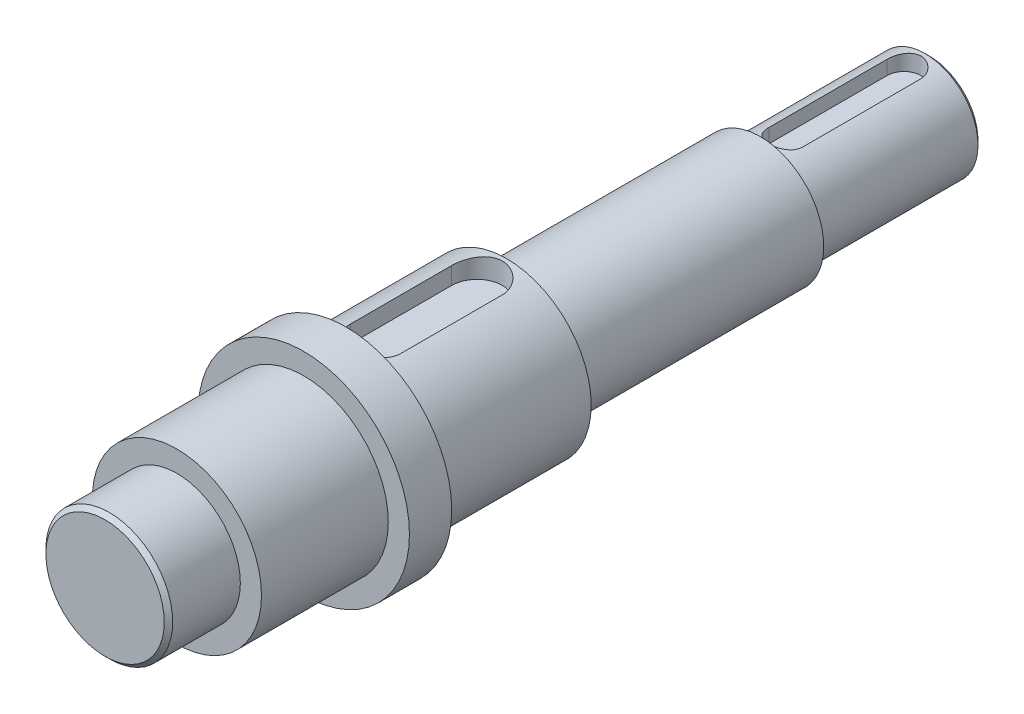
ISO-10303-21;
HEADER;
FILE_DESCRIPTION(('STEP AP214'),'2;1');
FILE_NAME('part.step','',(''),(''),'','','');
FILE_SCHEMA(('AUTOMOTIVE_DESIGN { 1 0 10303 214 1 1 1 1 }'));
ENDSEC;
DATA;
#1=APPLICATION_CONTEXT('core data for automotive mechanical design processes');
#2=APPLICATION_PROTOCOL_DEFINITION('international standard','automotive_design',2000,#1);
#3=PRODUCT_CONTEXT('',#1,'mechanical');
#4=PRODUCT('Part','Part','',(#3));
#5=PRODUCT_RELATED_PRODUCT_CATEGORY('part','',(#4));
#6=PRODUCT_DEFINITION_FORMATION('','',#4);
#7=PRODUCT_DEFINITION_CONTEXT('part definition',#1,'design');
#8=PRODUCT_DEFINITION('design','',#6,#7);
#9=PRODUCT_DEFINITION_SHAPE('','',#8);
#10=(LENGTH_UNIT() NAMED_UNIT(*) SI_UNIT(.MILLI.,.METRE.));
#11=(NAMED_UNIT(*) PLANE_ANGLE_UNIT() SI_UNIT($,.RADIAN.));
#12=(NAMED_UNIT(*) SI_UNIT($,.STERADIAN.) SOLID_ANGLE_UNIT());
#13=UNCERTAINTY_MEASURE_WITH_UNIT(LENGTH_MEASURE(1.E-05),#10,'distance_accuracy_value','');
#14=(GEOMETRIC_REPRESENTATION_CONTEXT(3) GLOBAL_UNCERTAINTY_ASSIGNED_CONTEXT((#13)) GLOBAL_UNIT_ASSIGNED_CONTEXT((#10,
#11,#12)) REPRESENTATION_CONTEXT('',''));
#15=CARTESIAN_POINT('',(0.,0.,0.));
#16=DIRECTION('',(0.,0.,1.));
#17=DIRECTION('',(1.,0.,0.));
#18=AXIS2_PLACEMENT_3D('',#15,#16,#17);
#19=CARTESIAN_POINT('',(0.,0.,40.));
#20=DIRECTION('',(0.,0.,-1.));
#21=DIRECTION('',(-1.,0.,0.));
#22=AXIS2_PLACEMENT_3D('',#19,#20,#21);
#23=CYLINDRICAL_SURFACE('',#22,12.5);
#24=CARTESIAN_POINT('',(0.,0.,40.));
#25=DIRECTION('',(0.,0.,1.));
#26=DIRECTION('',(1.,0.,0.));
#27=AXIS2_PLACEMENT_3D('',#24,#25,#26);
#28=CIRCLE('',#27,12.5);
#29=CARTESIAN_POINT('',(12.5,0.,40.));
#30=VERTEX_POINT('',#29);
#31=EDGE_CURVE('E177',#30,#30,#28,.T.);
#32=ORIENTED_EDGE('',*,*,#31,.F.);
#33=EDGE_LOOP('',(#32));
#34=FACE_BOUND('',#33,.T.);
#35=CARTESIAN_POINT('',(0.,0.,0.99999999999998));
#36=DIRECTION('',(0.,0.,1.));
#37=DIRECTION('',(1.,0.,0.));
#38=AXIS2_PLACEMENT_3D('',#35,#36,#37);
#39=CIRCLE('',#38,12.5);
#40=CARTESIAN_POINT('',(12.5,0.,0.99999999999998));
#41=VERTEX_POINT('',#40);
#42=EDGE_CURVE('E188',#41,#41,#39,.T.);
#43=ORIENTED_EDGE('',*,*,#42,.T.);
#44=EDGE_LOOP('',(#43));
#45=FACE_BOUND('',#44,.T.);
#46=CARTESIAN_POINT('',(4.,11.842719282327,6.));
#47=CARTESIAN_POINT('',(4.00001410484613,11.8427027366058,5.8906002280384));
#48=CARTESIAN_POINT('',(3.99551217520099,11.8442348052368,5.7812097901521));
#49=CARTESIAN_POINT('',(3.97758606678449,11.8502730910574,5.56327175926352));
#50=CARTESIAN_POINT('',(3.9641641287257,11.8547785613244,5.45472396151551));
#51=CARTESIAN_POINT('',(3.92855725119429,11.8666242076309,5.23953896915451));
#52=CARTESIAN_POINT('',(3.9063967602145,11.8739564736691,5.13289730438877));
#53=CARTESIAN_POINT('',(3.85353581488656,11.8912164993788,4.92199436162844));
#54=CARTESIAN_POINT('',(3.82283508754056,11.90114434202,4.81773315984322));
#55=CARTESIAN_POINT('',(3.71831764495512,11.9343840843196,4.50969499572164));
#56=CARTESIAN_POINT('',(3.63203544139887,11.9611699822066,4.31036344793197));
#57=CARTESIAN_POINT('',(3.42895021192288,12.0209583955878,3.92898744295816));
#58=CARTESIAN_POINT('',(3.31213030924909,12.0539643457894,3.74695262095034));
#59=CARTESIAN_POINT('',(3.0467850788479,12.123798407807,3.39874601140078));
#60=CARTESIAN_POINT('',(2.89735303896514,12.1607158548651,3.23328167566053));
#61=CARTESIAN_POINT('',(2.57296449846116,12.2334561140966,2.92928515141109));
#62=CARTESIAN_POINT('',(2.39800356343232,12.2692787347869,2.79075765164231));
#63=CARTESIAN_POINT('',(2.02237003010511,12.3368244653945,2.54138480162945));
#64=CARTESIAN_POINT('',(1.82118394546976,12.3684294972003,2.43127804353036));
#65=CARTESIAN_POINT('',(1.40197197350368,12.4229251649937,2.24675050465062));
#66=CARTESIAN_POINT('',(1.1839509190358,12.4458182908278,2.1723195262181));
#67=CARTESIAN_POINT('',(0.744713961063359,12.4796767811416,2.0636411357495));
#68=CARTESIAN_POINT('',(0.52382792010115,12.4910030499338,2.02817506661989));
#69=CARTESIAN_POINT('',(0.0789648151746332,12.5017287122873,1.99456720095836));
#70=CARTESIAN_POINT('',(-0.145011564197645,12.5011307063103,1.99641726647516));
#71=CARTESIAN_POINT('',(-0.581094974437695,12.4883236673358,2.03659882927133));
#72=CARTESIAN_POINT('',(-0.793338226675241,12.4765355800409,2.07360776797881));
#73=CARTESIAN_POINT('',(-1.20842320012721,12.443194578958,2.18088055160632));
#74=CARTESIAN_POINT('',(-1.41126440871778,12.4216411334261,2.2511462074328));
#75=CARTESIAN_POINT('',(-1.80478548808183,12.3706364987475,2.42375784223577));
#76=CARTESIAN_POINT('',(-1.99528012693527,12.3410893067347,2.52649651986879));
#77=CARTESIAN_POINT('',(-2.35673113106229,12.2771965403044,2.76082904904521));
#78=CARTESIAN_POINT('',(-2.52768253275751,12.2428497517893,2.89243020640299));
#79=CARTESIAN_POINT('',(-2.85304511528221,12.1712409097156,3.18744653129156));
#80=CARTESIAN_POINT('',(-3.00641313381737,12.1339170352569,3.3519967025921));
#81=CARTESIAN_POINT('',(-3.28377291775701,12.0618172896256,3.7049719000853));
#82=CARTESIAN_POINT('',(-3.40775562728565,12.0270422062066,3.89340425883215));
#83=CARTESIAN_POINT('',(-3.56958208232607,11.9796198433082,4.19137123774859));
#84=CARTESIAN_POINT('',(-3.61975674493765,11.9645161845072,4.29399905924155));
#85=CARTESIAN_POINT('',(-3.71123075156255,11.9364591580623,4.5034047527517));
#86=CARTESIAN_POINT('',(-3.75253376401034,11.9235049021446,4.61018088778642));
#87=CARTESIAN_POINT('',(-3.82585831579179,11.9001802342949,4.82701332789164));
#88=CARTESIAN_POINT('',(-3.85788979915529,11.889807055759,4.93706597797312));
#89=CARTESIAN_POINT('',(-3.91241790563964,11.8719756673203,5.1596951569476));
#90=CARTESIAN_POINT('',(-3.93491889994975,11.8645161211931,5.27227050379743));
#91=CARTESIAN_POINT('',(-3.96832908530803,11.8533815888388,5.48723924586099));
#92=CARTESIAN_POINT('',(-3.9802038456482,11.8493925948395,5.58946741579461));
#93=CARTESIAN_POINT('',(-3.99603937127681,11.8440568016292,5.79446107803332));
#94=CARTESIAN_POINT('',(-4.00001099551563,11.8427063770563,5.89722563828054));
#95=CARTESIAN_POINT('',(-4.,11.842719282327,6.));
#96=B_SPLINE_CURVE_WITH_KNOTS('',3,(#46,#47,#48,#49,#50,#51,#52,#53,#54,#55,#56,#57,#58,#59,#60,
#61,#62,#63,#64,#65,#66,#67,#68,#69,#70,#71,#72,#73,#74,#75,#76,#77,#78,#79,#80,#81,#82,#83,#84,
#85,#86,#87,#88,#89,#90,#91,#92,#93,#94,#95),.UNSPECIFIED.,.F.,.F.,(4,2,2,2,2,2,2,2,2,2,2,2,2,2,
2,2,2,2,2,2,2,2,2,2,4),(0.,0.328080176984104,0.656077971124947,0.983164539368218,1.310261564488,
1.96355293984248,2.61720612481382,3.29209427898756,3.96709980211697,4.65819584662373,
5.34909422856993,6.01770820975085,6.68617638029993,7.3304550155383,7.97476873730064,
8.6271932010581,9.27978300073407,9.96076419384897,10.6419549776068,10.9872862883783,
11.3324745283028,11.6772911585126,12.0219494657669,12.3305938648259,12.6388138912331),.UNSPECIFIED.);
#97=CARTESIAN_POINT('',(4.,11.842719282327,6.));
#98=VERTEX_POINT('',#97);
#99=CARTESIAN_POINT('',(-4.,11.842719282327,6.));
#100=VERTEX_POINT('',#99);
#101=EDGE_CURVE('E11',#98,#100,#96,.T.);
#102=ORIENTED_EDGE('',*,*,#101,.F.);
#103=DIRECTION('',(0.,0.,-1.));
#104=VECTOR('',#103,1.);
#105=CARTESIAN_POINT('',(4.,11.842719282327,40.));
#106=LINE('',#105,#104);
#107=CARTESIAN_POINT('',(4.,11.842719282327,34.));
#108=VERTEX_POINT('',#107);
#109=EDGE_CURVE('E233',#108,#98,#106,.T.);
#110=ORIENTED_EDGE('',*,*,#109,.F.);
#111=CARTESIAN_POINT('',(-4.,11.842719282327,34.));
#112=CARTESIAN_POINT('',(-4.00001410484613,11.8427027366058,34.1093997719616));
#113=CARTESIAN_POINT('',(-3.995512175201,11.8442348052368,34.2187902098479));
#114=CARTESIAN_POINT('',(-3.97758606678449,11.8502730910574,34.4367282407365));
#115=CARTESIAN_POINT('',(-3.96416412872571,11.8547785613244,34.5452760384845));
#116=CARTESIAN_POINT('',(-3.92855725119429,11.8666242076309,34.7604610308455));
#117=CARTESIAN_POINT('',(-3.9063967602145,11.8739564736691,34.8671026956112));
#118=CARTESIAN_POINT('',(-3.85353581488656,11.8912164993788,35.0780056383716));
#119=CARTESIAN_POINT('',(-3.82283508754056,11.90114434202,35.1822668401568));
#120=CARTESIAN_POINT('',(-3.71831764495512,11.9343840843196,35.4903050042784));
#121=CARTESIAN_POINT('',(-3.63203544139887,11.9611699822066,35.689636552068));
#122=CARTESIAN_POINT('',(-3.42895021192288,12.0209583955878,36.0710125570418));
#123=CARTESIAN_POINT('',(-3.31213030924909,12.0539643457894,36.2530473790497));
#124=CARTESIAN_POINT('',(-3.0467850788479,12.123798407807,36.6012539885992));
#125=CARTESIAN_POINT('',(-2.89735303896515,12.1607158548651,36.7667183243395));
#126=CARTESIAN_POINT('',(-2.57296449846117,12.2334561140966,37.0707148485889));
#127=CARTESIAN_POINT('',(-2.39800356343233,12.2692787347869,37.2092423483577));
#128=CARTESIAN_POINT('',(-2.02237003010512,12.3368244653945,37.4586151983705));
#129=CARTESIAN_POINT('',(-1.82118394546977,12.3684294972003,37.5687219564696));
#130=CARTESIAN_POINT('',(-1.40197197350369,12.4229251649937,37.7532494953494));
#131=CARTESIAN_POINT('',(-1.18395091903582,12.4458182908278,37.8276804737819));
#132=CARTESIAN_POINT('',(-0.744713961063371,12.4796767811416,37.9363588642505));
#133=CARTESIAN_POINT('',(-0.523827920101162,12.4910030499338,37.9718249333801));
#134=CARTESIAN_POINT('',(-0.0789648151746451,12.5017287122873,38.0054327990416));
#135=CARTESIAN_POINT('',(0.145011564197634,12.5011307063103,38.0035827335248));
#136=CARTESIAN_POINT('',(0.581094974437684,12.4883236673358,37.9634011707287));
#137=CARTESIAN_POINT('',(0.79333822667523,12.4765355800409,37.9263922320212));
#138=CARTESIAN_POINT('',(1.2084232001272,12.443194578958,37.8191194483937));
#139=CARTESIAN_POINT('',(1.41126440871777,12.4216411334262,37.7488537925672));
#140=CARTESIAN_POINT('',(1.80478548808182,12.3706364987475,37.5762421577642));
#141=CARTESIAN_POINT('',(1.99528012693526,12.3410893067347,37.4735034801312));
#142=CARTESIAN_POINT('',(2.35673113106228,12.2771965403044,37.2391709509548));
#143=CARTESIAN_POINT('',(2.52768253275749,12.2428497517893,37.107569793597));
#144=CARTESIAN_POINT('',(2.8530451152822,12.1712409097156,36.8125534687085));
#145=CARTESIAN_POINT('',(3.00641313381736,12.1339170352569,36.6480032974079));
#146=CARTESIAN_POINT('',(3.28377291775701,12.0618172896256,36.2950280999147));
#147=CARTESIAN_POINT('',(3.40775562728565,12.0270422062066,36.1065957411679));
#148=CARTESIAN_POINT('',(3.56958208232606,11.9796198433082,35.8086287622514));
#149=CARTESIAN_POINT('',(3.61975674493764,11.9645161845072,35.7060009407585));
#150=CARTESIAN_POINT('',(3.71123075156254,11.9364591580623,35.4965952472483));
#151=CARTESIAN_POINT('',(3.75253376401033,11.9235049021446,35.3898191122136));
#152=CARTESIAN_POINT('',(3.82585831579178,11.9001802342949,35.1729866721084));
#153=CARTESIAN_POINT('',(3.85788979915528,11.889807055759,35.0629340220269));
#154=CARTESIAN_POINT('',(3.91241790563963,11.8719756673203,34.8403048430524));
#155=CARTESIAN_POINT('',(3.93491889994975,11.8645161211931,34.7277294962026));
#156=CARTESIAN_POINT('',(3.96832908530803,11.8533815888388,34.512760754139));
#157=CARTESIAN_POINT('',(3.98020384564819,11.8493925948395,34.4105325842054));
#158=CARTESIAN_POINT('',(3.9960393712768,11.8440568016292,34.2055389219667));
#159=CARTESIAN_POINT('',(4.00001099551563,11.8427063770563,34.1027743617195));
#160=CARTESIAN_POINT('',(4.,11.842719282327,34.));
#161=B_SPLINE_CURVE_WITH_KNOTS('',3,(#111,#112,#113,#114,#115,#116,#117,#118,#119,#120,#121,
#122,#123,#124,#125,#126,#127,#128,#129,#130,#131,#132,#133,#134,#135,#136,#137,#138,#139,#140,
#141,#142,#143,#144,#145,#146,#147,#148,#149,#150,#151,#152,#153,#154,#155,#156,#157,#158,#159,
#160),.UNSPECIFIED.,.F.,.F.,(4,2,2,2,2,2,2,2,2,2,2,2,2,2,2,2,2,2,2,2,2,2,2,2,4),(0.,
0.328080176984097,0.656077971124942,0.983164539368206,1.31026156448799,1.96355293984247,
2.61720612481382,3.29209427898755,3.96709980211696,4.65819584662372,5.34909422856992,
6.01770820975084,6.68617638029992,7.33045501553829,7.97476873730063,8.62719320105809,
9.27978300073405,9.96076419384896,10.6419549776068,10.9872862883783,11.3324745283028,
11.6772911585126,12.0219494657669,12.3305938648258,12.6388138912331),.UNSPECIFIED.);
#162=CARTESIAN_POINT('',(-4.,11.842719282327,34.));
#163=VERTEX_POINT('',#162);
#164=EDGE_CURVE('E235',#163,#108,#161,.T.);
#165=ORIENTED_EDGE('',*,*,#164,.F.);
#166=DIRECTION('',(0.,0.,-1.));
#167=VECTOR('',#166,1.);
#168=CARTESIAN_POINT('',(-4.,11.842719282327,40.));
#169=LINE('',#168,#167);
#170=EDGE_CURVE('E46',#100,#163,#169,.F.);
#171=ORIENTED_EDGE('',*,*,#170,.F.);
#172=EDGE_LOOP('',(#102,#110,#165,#171));
#173=FACE_BOUND('',#172,.T.);
#174=ADVANCED_FACE('F33',(#34,#45,#173),#23,.T.);
#175=CARTESIAN_POINT('',(0.,0.,138.));
#176=DIRECTION('',(0.,0.,-1.));
#177=DIRECTION('',(-1.,0.,0.));
#178=AXIS2_PLACEMENT_3D('',#175,#176,#177);
#179=CYLINDRICAL_SURFACE('',#178,20.);
#180=CARTESIAN_POINT('',(0.,0.,100.));
#181=DIRECTION('',(0.,0.,1.));
#182=DIRECTION('',(1.,0.,0.));
#183=AXIS2_PLACEMENT_3D('',#180,#181,#182);
#184=CIRCLE('',#183,20.);
#185=CARTESIAN_POINT('',(20.,0.,100.));
#186=VERTEX_POINT('',#185);
#187=EDGE_CURVE('E165',#186,#186,#184,.T.);
#188=ORIENTED_EDGE('',*,*,#187,.T.);
#189=EDGE_LOOP('',(#188));
#190=FACE_BOUND('',#189,.T.);
#191=CARTESIAN_POINT('',(0.,0.,138.));
#192=DIRECTION('',(0.,0.,1.));
#193=DIRECTION('',(1.,0.,0.));
#194=AXIS2_PLACEMENT_3D('',#191,#192,#193);
#195=CIRCLE('',#194,20.);
#196=CARTESIAN_POINT('',(20.,0.,138.));
#197=VERTEX_POINT('',#196);
#198=EDGE_CURVE('E168',#197,#197,#195,.T.);
#199=ORIENTED_EDGE('',*,*,#198,.F.);
#200=EDGE_LOOP('',(#199));
#201=FACE_BOUND('',#200,.T.);
#202=CARTESIAN_POINT('',(-6.,19.0787840283389,131.));
#203=CARTESIAN_POINT('',(-6.00002230630954,19.0787603919218,131.164667994911));
#204=CARTESIAN_POINT('',(-5.99322212828861,19.0809150948054,131.32932738693));
#205=CARTESIAN_POINT('',(-5.96614198358438,19.089408588524,131.657389428385));
#206=CARTESIAN_POINT('',(-5.94586504749982,19.0957464386677,131.820792352014));
#207=CARTESIAN_POINT('',(-5.89206455668659,19.1124126760415,132.144766793684));
#208=CARTESIAN_POINT('',(-5.85857463708937,19.1227309292375,132.305344427964));
#209=CARTESIAN_POINT('',(-5.77865096251378,19.1470349488515,132.622962308668));
#210=CARTESIAN_POINT('',(-5.73221686903431,19.1610208111801,132.780002462469));
#211=CARTESIAN_POINT('',(-5.62682620459484,19.1922338155173,133.089382560724));
#212=CARTESIAN_POINT('',(-5.56787702452553,19.2094590438083,133.241725218776));
#213=CARTESIAN_POINT('',(-5.43788252899625,19.2466621419291,133.540874142902));
#214=CARTESIAN_POINT('',(-5.36683271334057,19.2666410353108,133.687678324328));
#215=CARTESIAN_POINT('',(-5.21317247195195,19.3087849542851,133.974784945253));
#216=CARTESIAN_POINT('',(-5.13056139609833,19.3309501027959,134.11508701853));
#217=CARTESIAN_POINT('',(-4.95431913401974,19.3768680311909,134.388387798675));
#218=CARTESIAN_POINT('',(-4.86068378223772,19.4006214097184,134.521383716872));
#219=CARTESIAN_POINT('',(-4.66024014290224,19.4497584548899,134.78286357323));
#220=CARTESIAN_POINT('',(-4.5531352636269,19.4751691904069,134.911115152198));
#221=CARTESIAN_POINT('',(-4.32860344600265,19.5263015189751,135.158253937009));
#222=CARTESIAN_POINT('',(-4.21117292654718,19.5520232171847,135.277137866671));
#223=CARTESIAN_POINT('',(-3.96676059198591,19.6030710031715,135.504741395122));
#224=CARTESIAN_POINT('',(-3.83977871873937,19.6283970885393,135.613460932029));
#225=CARTESIAN_POINT('',(-3.57705696576209,19.6779706962222,135.820019254473));
#226=CARTESIAN_POINT('',(-3.44131715512968,19.7022182270443,135.917858125839));
#227=CARTESIAN_POINT('',(-3.15899953964077,19.7494715734221,136.10390976826));
#228=CARTESIAN_POINT('',(-3.01225429870653,19.7724407517412,136.191878046302));
#229=CARTESIAN_POINT('',(-2.71155717798051,19.8159158974823,136.355063794055));
#230=CARTESIAN_POINT('',(-2.55760798995096,19.8364227748921,136.430285978567));
#231=CARTESIAN_POINT('',(-2.2434899603248,19.8744001644265,136.567416439371));
#232=CARTESIAN_POINT('',(-2.08331997555617,19.8918701152059,136.629322254768));
#233=CARTESIAN_POINT('',(-1.75801430484771,19.923254535561,136.739237502456));
#234=CARTESIAN_POINT('',(-1.59288079897388,19.9371705413066,136.787252939968));
#235=CARTESIAN_POINT('',(-1.26354510595573,19.960709769643,136.867825546728));
#236=CARTESIAN_POINT('',(-1.09944808925077,19.9704430293701,136.900780626958));
#237=CARTESIAN_POINT('',(-0.768952154148936,19.9858966495547,136.952871997286));
#238=CARTESIAN_POINT('',(-0.602554181799286,19.9916186120195,136.972013804135));
#239=CARTESIAN_POINT('',(-0.268644299740224,19.9988929276978,136.996319964857));
#240=CARTESIAN_POINT('',(-0.10113235636097,20.0004451543012,137.001483894306));
#241=CARTESIAN_POINT('',(0.233720900410864,19.9993350985709,136.997783594922));
#242=CARTESIAN_POINT('',(0.401062216878506,19.9966728935831,136.988919623537));
#243=CARTESIAN_POINT('',(0.728949940400312,19.9873626800314,136.957757788398));
#244=CARTESIAN_POINT('',(0.889542117296658,19.9808452710305,136.935899990017));
#245=CARTESIAN_POINT('',(1.20830021014907,19.9641050678088,136.879304518242));
#246=CARTESIAN_POINT('',(1.36646528055415,19.9538810115069,136.844562457775));
#247=CARTESIAN_POINT('',(1.67917461818939,19.9300014175933,136.76250769839));
#248=CARTESIAN_POINT('',(1.83372008335732,19.916347033335,136.715199224277));
#249=CARTESIAN_POINT('',(2.13828018933735,19.885954581515,136.608369728937));
#250=CARTESIAN_POINT('',(2.2882931022387,19.8692153547843,136.548844116003));
#251=CARTESIAN_POINT('',(2.58443507880942,19.8328818557961,136.417309420461));
#252=CARTESIAN_POINT('',(2.7305012482212,19.8132575095082,136.345167102802));
#253=CARTESIAN_POINT('',(3.0160963237542,19.7717979578185,136.189376852671));
#254=CARTESIAN_POINT('',(3.1556229642424,19.7499619943591,136.105724971616));
#255=CARTESIAN_POINT('',(3.4272438468689,19.704643118031,135.927513017559));
#256=CARTESIAN_POINT('',(3.55933800314025,19.681160186142,135.832952818572));
#257=CARTESIAN_POINT('',(3.81531376455355,19.6331439703208,135.633541321571));
#258=CARTESIAN_POINT('',(3.93919513006484,19.6086106557752,135.528689723499));
#259=CARTESIAN_POINT('',(4.18263653591652,19.5581593507452,135.305102756537));
#260=CARTESIAN_POINT('',(4.30184428600933,19.5322244988475,135.185987320526));
#261=CARTESIAN_POINT('',(4.52981041510267,19.4806179410542,134.938166496498));
#262=CARTESIAN_POINT('',(4.63857214120815,19.454946153239,134.809464203919));
#263=CARTESIAN_POINT('',(4.84504126060965,19.4045581786367,134.543159603762));
#264=CARTESIAN_POINT('',(4.94274124635231,19.3798426394128,134.405551428099));
#265=CARTESIAN_POINT('',(5.12628631686323,19.3321023379674,134.122440907667));
#266=CARTESIAN_POINT('',(5.21213600998878,19.3090769201297,133.976941662422));
#267=CARTESIAN_POINT('',(5.37223080367567,19.2651525602885,133.677364864907));
#268=CARTESIAN_POINT('',(5.44634371437402,19.2442786555291,133.523212921341));
#269=CARTESIAN_POINT('',(5.58122691640504,19.2055937237889,133.208878158639));
#270=CARTESIAN_POINT('',(5.64200266456204,19.1877814448102,133.048697837522));
#271=CARTESIAN_POINT('',(5.74966145349632,19.1557967477957,132.72356788165));
#272=CARTESIAN_POINT('',(5.79655912825487,19.1416204978023,132.558623473437));
#273=CARTESIAN_POINT('',(5.87609462586438,19.1173543231183,132.225106819549));
#274=CARTESIAN_POINT('',(5.90873902604377,19.1072625137754,132.056536284952));
#275=CARTESIAN_POINT('',(5.95603131732401,19.0925703406668,131.740062929764));
#276=CARTESIAN_POINT('',(5.97251971262425,19.0874107715083,131.59245829064));
#277=CARTESIAN_POINT('',(5.99450261914156,19.0805126306352,131.296572887525));
#278=CARTESIAN_POINT('',(6.00001329545508,19.0787690288453,131.148293440425));
#279=CARTESIAN_POINT('',(6.,19.0787840283389,131.));
#280=B_SPLINE_CURVE_WITH_KNOTS('',3,(#202,#203,#204,#205,#206,#207,#208,#209,#210,#211,#212,
#213,#214,#215,#216,#217,#218,#219,#220,#221,#222,#223,#224,#225,#226,#227,#228,#229,#230,#231,
#232,#233,#234,#235,#236,#237,#238,#239,#240,#241,#242,#243,#244,#245,#246,#247,#248,#249,#250,
#251,#252,#253,#254,#255,#256,#257,#258,#259,#260,#261,#262,#263,#264,#265,#266,#267,#268,#269,
#270,#271,#272,#273,#274,#275,#276,#277,#278,#279),.UNSPECIFIED.,.F.,.F.,(4,2,2,2,2,2,2,2,2,2,2,
2,2,2,2,2,2,2,2,2,2,2,2,2,2,2,2,2,2,2,2,2,2,2,2,2,2,2,4),(0.,0.493836284878976,
0.987561555412188,1.48003801924602,1.97252736296405,2.46472666795181,2.95710942192586,
3.44951987503682,3.94211698772999,4.44857898474593,4.95521732942468,5.46185875834849,
5.96849619046396,6.48574341264194,7.00279888450887,7.51994982748062,8.03687685551446,
8.5392195832838,9.0413615740179,9.54351881163821,10.0456668334346,10.531706521874,
11.0179118582603,11.5039539397552,11.9901790315928,12.4818885441265,12.9737671698834,
13.4656514771114,13.9575501300996,14.4684682486943,14.9792221093922,15.4903160010786,
16.001210574562,16.5175029344931,17.0335836608614,17.5491182415751,18.0644146711719,
18.509813123396,18.9545552237083),.UNSPECIFIED.);
#281=CARTESIAN_POINT('',(-6.,19.0787840283389,131.));
#282=VERTEX_POINT('',#281);
#283=CARTESIAN_POINT('',(6.,19.0787840283389,131.));
#284=VERTEX_POINT('',#283);
#285=EDGE_CURVE('E228',#282,#284,#280,.T.);
#286=ORIENTED_EDGE('',*,*,#285,.F.);
#287=DIRECTION('',(0.,0.,-1.));
#288=VECTOR('',#287,1.);
#289=CARTESIAN_POINT('',(-6.,19.0787840283389,138.));
#290=LINE('',#289,#288);
#291=CARTESIAN_POINT('',(-6.,19.0787840283389,107.));
#292=VERTEX_POINT('',#291);
#293=EDGE_CURVE('E194',#292,#282,#290,.F.);
#294=ORIENTED_EDGE('',*,*,#293,.F.);
#295=CARTESIAN_POINT('',(6.,19.0787840283389,107.));
#296=CARTESIAN_POINT('',(6.00002230630953,19.0787603919218,106.835332005089));
#297=CARTESIAN_POINT('',(5.99322212828861,19.0809150948054,106.67067261307));
#298=CARTESIAN_POINT('',(5.96614198358438,19.089408588524,106.342610571615));
#299=CARTESIAN_POINT('',(5.94586504749982,19.0957464386677,106.179207647986));
#300=CARTESIAN_POINT('',(5.89206455668659,19.1124126760415,105.855233206316));
#301=CARTESIAN_POINT('',(5.85857463708937,19.1227309292375,105.694655572036));
#302=CARTESIAN_POINT('',(5.77865096251378,19.1470349488515,105.377037691332));
#303=CARTESIAN_POINT('',(5.73221686903431,19.1610208111801,105.219997537531));
#304=CARTESIAN_POINT('',(5.62682620459483,19.1922338155173,104.910617439276));
#305=CARTESIAN_POINT('',(5.56787702452552,19.2094590438083,104.758274781224));
#306=CARTESIAN_POINT('',(5.43788252899624,19.2466621419291,104.459125857098));
#307=CARTESIAN_POINT('',(5.36683271334056,19.2666410353108,104.312321675672));
#308=CARTESIAN_POINT('',(5.21317247195194,19.3087849542851,104.025215054747));
#309=CARTESIAN_POINT('',(5.13056139609831,19.3309501027959,103.88491298147));
#310=CARTESIAN_POINT('',(4.95431913401972,19.3768680311909,103.611612201325));
#311=CARTESIAN_POINT('',(4.8606837822377,19.4006214097184,103.478616283128));
#312=CARTESIAN_POINT('',(4.66024014290222,19.4497584548899,103.21713642677));
#313=CARTESIAN_POINT('',(4.55313526362689,19.4751691904069,103.088884847802));
#314=CARTESIAN_POINT('',(4.32860344600265,19.5263015189751,102.841746062991));
#315=CARTESIAN_POINT('',(4.21117292654717,19.5520232171847,102.722862133329));
#316=CARTESIAN_POINT('',(3.9667605919859,19.6030710031715,102.495258604878));
#317=CARTESIAN_POINT('',(3.83977871873937,19.6283970885393,102.386539067971));
#318=CARTESIAN_POINT('',(3.57705696576209,19.6779706962222,102.179980745528));
#319=CARTESIAN_POINT('',(3.44131715512967,19.7022182270443,102.082141874161));
#320=CARTESIAN_POINT('',(3.15899953964075,19.7494715734221,101.89609023174));
#321=CARTESIAN_POINT('',(3.01225429870652,19.7724407517412,101.808121953698));
#322=CARTESIAN_POINT('',(2.71155717798051,19.8159158974823,101.644936205945));
#323=CARTESIAN_POINT('',(2.55760798995095,19.8364227748921,101.569714021433));
#324=CARTESIAN_POINT('',(2.2434899603248,19.8744001644265,101.432583560629));
#325=CARTESIAN_POINT('',(2.08331997555617,19.8918701152059,101.370677745232));
#326=CARTESIAN_POINT('',(1.75801430484772,19.923254535561,101.260762497544));
#327=CARTESIAN_POINT('',(1.59288079897388,19.9371705413066,101.212747060032));
#328=CARTESIAN_POINT('',(1.26354510595574,19.960709769643,101.132174453272));
#329=CARTESIAN_POINT('',(1.09944808925078,19.9704430293701,101.099219373042));
#330=CARTESIAN_POINT('',(0.768952154148946,19.9858966495547,101.047128002714));
#331=CARTESIAN_POINT('',(0.602554181799292,19.9916186120195,101.027986195865));
#332=CARTESIAN_POINT('',(0.268644299740228,19.9988929276978,101.003680035143));
#333=CARTESIAN_POINT('',(0.101132356360975,20.0004451543012,100.998516105694));
#334=CARTESIAN_POINT('',(-0.23372090041086,19.9993350985709,101.002216405078));
#335=CARTESIAN_POINT('',(-0.401062216878501,19.9966728935831,101.011080376463));
#336=CARTESIAN_POINT('',(-0.728949940400308,19.9873626800314,101.042242211602));
#337=CARTESIAN_POINT('',(-0.889542117296655,19.9808452710305,101.064100009983));
#338=CARTESIAN_POINT('',(-1.20830021014906,19.9641050678088,101.120695481758));
#339=CARTESIAN_POINT('',(-1.36646528055415,19.9538810115069,101.155437542225));
#340=CARTESIAN_POINT('',(-1.67917461818938,19.9300014175933,101.23749230161));
#341=CARTESIAN_POINT('',(-1.83372008335732,19.916347033335,101.284800775723));
#342=CARTESIAN_POINT('',(-2.13828018933735,19.885954581515,101.391630271063));
#343=CARTESIAN_POINT('',(-2.2882931022387,19.8692153547843,101.451155883997));
#344=CARTESIAN_POINT('',(-2.58443507880942,19.8328818557961,101.582690579539));
#345=CARTESIAN_POINT('',(-2.7305012482212,19.8132575095082,101.654832897198));
#346=CARTESIAN_POINT('',(-3.0160963237542,19.7717979578185,101.810623147329));
#347=CARTESIAN_POINT('',(-3.15562296424241,19.7499619943591,101.894275028384));
#348=CARTESIAN_POINT('',(-3.42724384686891,19.704643118031,102.072486982441));
#349=CARTESIAN_POINT('',(-3.55933800314027,19.681160186142,102.167047181428));
#350=CARTESIAN_POINT('',(-3.81531376455356,19.6331439703208,102.366458678429));
#351=CARTESIAN_POINT('',(-3.93919513006485,19.6086106557752,102.471310276501));
#352=CARTESIAN_POINT('',(-4.18263653591652,19.5581593507452,102.694897243463));
#353=CARTESIAN_POINT('',(-4.30184428600934,19.5322244988475,102.814012679474));
#354=CARTESIAN_POINT('',(-4.52981041510267,19.4806179410542,103.061833503502));
#355=CARTESIAN_POINT('',(-4.63857214120816,19.454946153239,103.190535796081));
#356=CARTESIAN_POINT('',(-4.84504126060966,19.4045581786367,103.456840396238));
#357=CARTESIAN_POINT('',(-4.94274124635233,19.3798426394128,103.594448571901));
#358=CARTESIAN_POINT('',(-5.12628631686324,19.3321023379674,103.877559092333));
#359=CARTESIAN_POINT('',(-5.21213600998877,19.3090769201297,104.023058337578));
#360=CARTESIAN_POINT('',(-5.37223080367566,19.2651525602885,104.322635135093));
#361=CARTESIAN_POINT('',(-5.44634371437402,19.2442786555291,104.476787078659));
#362=CARTESIAN_POINT('',(-5.58122691640503,19.2055937237889,104.791121841361));
#363=CARTESIAN_POINT('',(-5.64200266456203,19.1877814448102,104.951302162478));
#364=CARTESIAN_POINT('',(-5.74966145349631,19.1557967477957,105.27643211835));
#365=CARTESIAN_POINT('',(-5.79655912825487,19.1416204978023,105.441376526563));
#366=CARTESIAN_POINT('',(-5.87609462586438,19.1173543231182,105.774893180451));
#367=CARTESIAN_POINT('',(-5.90873902604377,19.1072625137754,105.943463715049));
#368=CARTESIAN_POINT('',(-5.95603131732401,19.0925703406668,106.259937070236));
#369=CARTESIAN_POINT('',(-5.97251971262425,19.0874107715083,106.40754170936));
#370=CARTESIAN_POINT('',(-5.99450261914156,19.0805126306352,106.703427112475));
#371=CARTESIAN_POINT('',(-6.00001329545509,19.0787690288453,106.851706559575));
#372=CARTESIAN_POINT('',(-6.,19.0787840283389,107.));
#373=B_SPLINE_CURVE_WITH_KNOTS('',3,(#295,#296,#297,#298,#299,#300,#301,#302,#303,#304,#305,
#306,#307,#308,#309,#310,#311,#312,#313,#314,#315,#316,#317,#318,#319,#320,#321,#322,#323,#324,
#325,#326,#327,#328,#329,#330,#331,#332,#333,#334,#335,#336,#337,#338,#339,#340,#341,#342,#343,
#344,#345,#346,#347,#348,#349,#350,#351,#352,#353,#354,#355,#356,#357,#358,#359,#360,#361,#362,
#363,#364,#365,#366,#367,#368,#369,#370,#371,#372),.UNSPECIFIED.,.F.,.F.,(4,2,2,2,2,2,2,2,2,2,2,
2,2,2,2,2,2,2,2,2,2,2,2,2,2,2,2,2,2,2,2,2,2,2,2,2,2,2,4),(0.,0.493836284878948,
0.987561555412188,1.48003801924604,1.97252736296405,2.46472666795182,2.95710942192589,
3.44951987503686,3.94211698773002,4.44857898474592,4.95521732942468,5.46185875834848,
5.96849619046397,6.48574341264196,7.00279888450886,7.51994982748061,8.03687685551445,
8.53921958328378,9.04136157401789,9.5435188116382,10.0456668334346,10.531706521874,
11.0179118582603,11.5039539397551,11.9901790315928,12.4818885441265,12.9737671698834,
13.4656514771114,13.9575501300996,14.4684682486942,14.9792221093922,15.4903160010787,
16.001210574562,16.517502934493,17.0335836608614,17.5491182415751,18.0644146711719,
18.509813123396,18.9545552237083),.UNSPECIFIED.);
#374=CARTESIAN_POINT('',(6.,19.0787840283389,107.));
#375=VERTEX_POINT('',#374);
#376=EDGE_CURVE('E196',#375,#292,#373,.T.);
#377=ORIENTED_EDGE('',*,*,#376,.F.);
#378=DIRECTION('',(0.,0.,-1.));
#379=VECTOR('',#378,1.);
#380=CARTESIAN_POINT('',(6.,19.0787840283389,138.));
#381=LINE('',#380,#379);
#382=EDGE_CURVE('E203',#284,#375,#381,.T.);
#383=ORIENTED_EDGE('',*,*,#382,.F.);
#384=EDGE_LOOP('',(#286,#294,#377,#383));
#385=FACE_BOUND('',#384,.T.);
#386=ADVANCED_FACE('F205',(#190,#201,#385),#179,.T.);
#387=CARTESIAN_POINT('',(0.,0.,0.));
#388=DIRECTION('',(0.,0.,1.));
#389=DIRECTION('',(1.,0.,0.));
#390=AXIS2_PLACEMENT_3D('',#387,#388,#389);
#391=PLANE('',#390);
#392=CARTESIAN_POINT('',(0.,0.,0.));
#393=DIRECTION('',(0.,0.,1.));
#394=DIRECTION('',(1.,0.,0.));
#395=AXIS2_PLACEMENT_3D('',#392,#393,#394);
#396=CIRCLE('',#395,11.5);
#397=CARTESIAN_POINT('',(11.5,0.,0.));
#398=VERTEX_POINT('',#397);
#399=EDGE_CURVE('E191',#398,#398,#396,.F.);
#400=ORIENTED_EDGE('',*,*,#399,.T.);
#401=EDGE_LOOP('',(#400));
#402=FACE_BOUND('',#401,.T.);
#403=ADVANCED_FACE('F264',(#402),#391,.F.);
#404=CARTESIAN_POINT('',(0.,0.,100.));
#405=DIRECTION('',(0.,0.,-1.));
#406=DIRECTION('',(-1.,0.,0.));
#407=AXIS2_PLACEMENT_3D('',#404,#405,#406);
#408=CYLINDRICAL_SURFACE('',#407,15.);
#409=CARTESIAN_POINT('',(0.,0.,100.));
#410=DIRECTION('',(0.,0.,1.));
#411=DIRECTION('',(1.,0.,0.));
#412=AXIS2_PLACEMENT_3D('',#409,#410,#411);
#413=CIRCLE('',#412,15.);
#414=CARTESIAN_POINT('',(15.,0.,100.));
#415=VERTEX_POINT('',#414);
#416=EDGE_CURVE('E174',#415,#415,#413,.T.);
#417=ORIENTED_EDGE('',*,*,#416,.F.);
#418=EDGE_LOOP('',(#417));
#419=FACE_BOUND('',#418,.T.);
#420=CARTESIAN_POINT('',(0.,0.,40.));
#421=DIRECTION('',(0.,0.,1.));
#422=DIRECTION('',(1.,0.,0.));
#423=AXIS2_PLACEMENT_3D('',#420,#421,#422);
#424=CIRCLE('',#423,15.);
#425=CARTESIAN_POINT('',(15.,0.,40.));
#426=VERTEX_POINT('',#425);
#427=EDGE_CURVE('E171',#426,#426,#424,.T.);
#428=ORIENTED_EDGE('',*,*,#427,.T.);
#429=EDGE_LOOP('',(#428));
#430=FACE_BOUND('',#429,.T.);
#431=ADVANCED_FACE('F358',(#419,#430),#408,.T.);
#432=CARTESIAN_POINT('',(0.,0.,40.));
#433=DIRECTION('',(0.,0.,1.));
#434=DIRECTION('',(1.,0.,0.));
#435=AXIS2_PLACEMENT_3D('',#432,#433,#434);
#436=PLANE('',#435);
#437=ORIENTED_EDGE('',*,*,#31,.T.);
#438=EDGE_LOOP('',(#437));
#439=FACE_BOUND('',#438,.T.);
#440=ORIENTED_EDGE('',*,*,#427,.F.);
#441=EDGE_LOOP('',(#440));
#442=FACE_BOUND('',#441,.T.);
#443=ADVANCED_FACE('F443',(#439,#442),#436,.F.);
#444=CARTESIAN_POINT('',(0.,0.,100.));
#445=DIRECTION('',(0.,0.,1.));
#446=DIRECTION('',(1.,0.,0.));
#447=AXIS2_PLACEMENT_3D('',#444,#445,#446);
#448=PLANE('',#447);
#449=ORIENTED_EDGE('',*,*,#416,.T.);
#450=EDGE_LOOP('',(#449));
#451=FACE_BOUND('',#450,.T.);
#452=ORIENTED_EDGE('',*,*,#187,.F.);
#453=EDGE_LOOP('',(#452));
#454=FACE_BOUND('',#453,.T.);
#455=ADVANCED_FACE('F433',(#451,#454),#448,.F.);
#456=CARTESIAN_POINT('',(0.,0.,148.));
#457=DIRECTION('',(0.,0.,-1.));
#458=DIRECTION('',(-1.,0.,0.));
#459=AXIS2_PLACEMENT_3D('',#456,#457,#458);
#460=CYLINDRICAL_SURFACE('',#459,25.);
#461=CARTESIAN_POINT('',(0.,0.,148.));
#462=DIRECTION('',(0.,0.,1.));
#463=DIRECTION('',(1.,0.,0.));
#464=AXIS2_PLACEMENT_3D('',#461,#462,#463);
#465=CIRCLE('',#464,25.);
#466=CARTESIAN_POINT('',(25.,0.,148.));
#467=VERTEX_POINT('',#466);
#468=EDGE_CURVE('E162',#467,#467,#465,.T.);
#469=ORIENTED_EDGE('',*,*,#468,.F.);
#470=EDGE_LOOP('',(#469));
#471=FACE_BOUND('',#470,.T.);
#472=CARTESIAN_POINT('',(0.,0.,138.));
#473=DIRECTION('',(0.,0.,1.));
#474=DIRECTION('',(1.,0.,0.));
#475=AXIS2_PLACEMENT_3D('',#472,#473,#474);
#476=CIRCLE('',#475,25.);
#477=CARTESIAN_POINT('',(25.,0.,138.));
#478=VERTEX_POINT('',#477);
#479=EDGE_CURVE('E159',#478,#478,#476,.T.);
#480=ORIENTED_EDGE('',*,*,#479,.T.);
#481=EDGE_LOOP('',(#480));
#482=FACE_BOUND('',#481,.T.);
#483=ADVANCED_FACE('F416',(#471,#482),#460,.T.);
#484=CARTESIAN_POINT('',(0.,0.,148.));
#485=DIRECTION('',(0.,0.,1.));
#486=DIRECTION('',(1.,0.,0.));
#487=AXIS2_PLACEMENT_3D('',#484,#485,#486);
#488=PLANE('',#487);
#489=CARTESIAN_POINT('',(0.,0.,148.));
#490=DIRECTION('',(0.,0.,1.));
#491=DIRECTION('',(1.,0.,0.));
#492=AXIS2_PLACEMENT_3D('',#489,#490,#491);
#493=CIRCLE('',#492,20.);
#494=CARTESIAN_POINT('',(20.,0.,148.));
#495=VERTEX_POINT('',#494);
#496=EDGE_CURVE('E155',#495,#495,#493,.T.);
#497=ORIENTED_EDGE('',*,*,#496,.F.);
#498=EDGE_LOOP('',(#497));
#499=FACE_BOUND('',#498,.T.);
#500=ORIENTED_EDGE('',*,*,#468,.T.);
#501=EDGE_LOOP('',(#500));
#502=FACE_BOUND('',#501,.T.);
#503=ADVANCED_FACE('F411',(#499,#502),#488,.T.);
#504=CARTESIAN_POINT('',(0.,0.,138.));
#505=DIRECTION('',(0.,0.,1.));
#506=DIRECTION('',(1.,0.,0.));
#507=AXIS2_PLACEMENT_3D('',#504,#505,#506);
#508=PLANE('',#507);
#509=ORIENTED_EDGE('',*,*,#198,.T.);
#510=EDGE_LOOP('',(#509));
#511=FACE_BOUND('',#510,.T.);
#512=ORIENTED_EDGE('',*,*,#479,.F.);
#513=EDGE_LOOP('',(#512));
#514=FACE_BOUND('',#513,.T.);
#515=ADVANCED_FACE('F403',(#511,#514),#508,.F.);
#516=CARTESIAN_POINT('',(0.,0.,178.));
#517=DIRECTION('',(0.,0.,-1.));
#518=DIRECTION('',(-1.,0.,0.));
#519=AXIS2_PLACEMENT_3D('',#516,#517,#518);
#520=CYLINDRICAL_SURFACE('',#519,20.);
#521=CARTESIAN_POINT('',(0.,0.,178.));
#522=DIRECTION('',(0.,0.,1.));
#523=DIRECTION('',(1.,0.,0.));
#524=AXIS2_PLACEMENT_3D('',#521,#522,#523);
#525=CIRCLE('',#524,20.);
#526=CARTESIAN_POINT('',(20.,0.,178.));
#527=VERTEX_POINT('',#526);
#528=EDGE_CURVE('E156',#527,#527,#525,.T.);
#529=ORIENTED_EDGE('',*,*,#528,.F.);
#530=EDGE_LOOP('',(#529));
#531=FACE_BOUND('',#530,.T.);
#532=ORIENTED_EDGE('',*,*,#496,.T.);
#533=EDGE_LOOP('',(#532));
#534=FACE_BOUND('',#533,.T.);
#535=ADVANCED_FACE('F393',(#531,#534),#520,.T.);
#536=CARTESIAN_POINT('',(0.,0.,178.));
#537=DIRECTION('',(0.,0.,1.));
#538=DIRECTION('',(1.,0.,0.));
#539=AXIS2_PLACEMENT_3D('',#536,#537,#538);
#540=PLANE('',#539);
#541=CARTESIAN_POINT('',(0.,0.,178.));
#542=DIRECTION('',(0.,0.,1.));
#543=DIRECTION('',(1.,0.,0.));
#544=AXIS2_PLACEMENT_3D('',#541,#542,#543);
#545=CIRCLE('',#544,15.);
#546=CARTESIAN_POINT('',(15.,0.,178.));
#547=VERTEX_POINT('',#546);
#548=EDGE_CURVE('E152',#547,#547,#545,.T.);
#549=ORIENTED_EDGE('',*,*,#548,.F.);
#550=EDGE_LOOP('',(#549));
#551=FACE_BOUND('',#550,.T.);
#552=ORIENTED_EDGE('',*,*,#528,.T.);
#553=EDGE_LOOP('',(#552));
#554=FACE_BOUND('',#553,.T.);
#555=ADVANCED_FACE('F384',(#551,#554),#540,.T.);
#556=CARTESIAN_POINT('',(0.,0.,195.));
#557=DIRECTION('',(0.,0.,-1.));
#558=DIRECTION('',(-1.,0.,0.));
#559=AXIS2_PLACEMENT_3D('',#556,#557,#558);
#560=CYLINDRICAL_SURFACE('',#559,15.);
#561=CARTESIAN_POINT('',(0.,0.,194.));
#562=DIRECTION('',(0.,0.,1.));
#563=DIRECTION('',(1.,0.,0.));
#564=AXIS2_PLACEMENT_3D('',#561,#562,#563);
#565=CIRCLE('',#564,15.);
#566=CARTESIAN_POINT('',(15.,0.,194.));
#567=VERTEX_POINT('',#566);
#568=EDGE_CURVE('E185',#567,#567,#565,.F.);
#569=ORIENTED_EDGE('',*,*,#568,.T.);
#570=EDGE_LOOP('',(#569));
#571=FACE_BOUND('',#570,.T.);
#572=ORIENTED_EDGE('',*,*,#548,.T.);
#573=EDGE_LOOP('',(#572));
#574=FACE_BOUND('',#573,.T.);
#575=ADVANCED_FACE('F375',(#571,#574),#560,.T.);
#576=CARTESIAN_POINT('',(0.,0.,195.));
#577=DIRECTION('',(0.,0.,1.));
#578=DIRECTION('',(1.,0.,0.));
#579=AXIS2_PLACEMENT_3D('',#576,#577,#578);
#580=PLANE('',#579);
#581=CARTESIAN_POINT('',(0.,0.,195.));
#582=DIRECTION('',(0.,0.,1.));
#583=DIRECTION('',(1.,0.,0.));
#584=AXIS2_PLACEMENT_3D('',#581,#582,#583);
#585=CIRCLE('',#584,14.);
#586=CARTESIAN_POINT('',(14.,0.,195.));
#587=VERTEX_POINT('',#586);
#588=EDGE_CURVE('E182',#587,#587,#585,.T.);
#589=ORIENTED_EDGE('',*,*,#588,.T.);
#590=EDGE_LOOP('',(#589));
#591=FACE_BOUND('',#590,.T.);
#592=ADVANCED_FACE('F226',(#591),#580,.T.);
#593=CARTESIAN_POINT('',(0.,0.,195.));
#594=DIRECTION('',(0.,0.,-1.));
#595=DIRECTION('',(-1.,0.,0.));
#596=AXIS2_PLACEMENT_3D('',#593,#594,#595);
#597=CONICAL_SURFACE('',#596,14.,0.785398163397456);
#598=ORIENTED_EDGE('',*,*,#568,.F.);
#599=EDGE_LOOP('',(#598));
#600=FACE_BOUND('',#599,.T.);
#601=ORIENTED_EDGE('',*,*,#588,.F.);
#602=EDGE_LOOP('',(#601));
#603=FACE_BOUND('',#602,.T.);
#604=ADVANCED_FACE('F348',(#600,#603),#597,.T.);
#605=CARTESIAN_POINT('',(0.,0.,0.99999999999998));
#606=DIRECTION('',(0.,0.,1.));
#607=DIRECTION('',(1.,0.,0.));
#608=AXIS2_PLACEMENT_3D('',#605,#606,#607);
#609=CONICAL_SURFACE('',#608,12.5,0.785398163397453);
#610=ORIENTED_EDGE('',*,*,#399,.F.);
#611=EDGE_LOOP('',(#610));
#612=FACE_BOUND('',#611,.T.);
#613=ORIENTED_EDGE('',*,*,#42,.F.);
#614=EDGE_LOOP('',(#613));
#615=FACE_BOUND('',#614,.T.);
#616=ADVANCED_FACE('F35',(#612,#615),#609,.T.);
#617=CARTESIAN_POINT('',(0.,39.,131.));
#618=DIRECTION('',(0.,-1.,0.));
#619=DIRECTION('',(0.,0.,-1.));
#620=AXIS2_PLACEMENT_3D('',#617,#618,#619);
#621=CYLINDRICAL_SURFACE('',#620,6.);
#622=ORIENTED_EDGE('',*,*,#285,.T.);
#623=DIRECTION('',(0.,-1.,0.));
#624=VECTOR('',#623,1.);
#625=CARTESIAN_POINT('',(6.,39.,131.));
#626=LINE('',#625,#624);
#627=CARTESIAN_POINT('',(6.,15.,131.));
#628=VERTEX_POINT('',#627);
#629=EDGE_CURVE('E150',#284,#628,#626,.T.);
#630=ORIENTED_EDGE('',*,*,#629,.T.);
#631=CARTESIAN_POINT('',(0.,15.,131.));
#632=DIRECTION('',(0.,1.,0.));
#633=DIRECTION('',(0.,0.,1.));
#634=AXIS2_PLACEMENT_3D('',#631,#632,#633);
#635=CIRCLE('',#634,6.);
#636=CARTESIAN_POINT('',(-6.,15.,131.));
#637=VERTEX_POINT('',#636);
#638=EDGE_CURVE('E111',#637,#628,#635,.T.);
#639=ORIENTED_EDGE('',*,*,#638,.F.);
#640=DIRECTION('',(0.,-1.,0.));
#641=VECTOR('',#640,1.);
#642=CARTESIAN_POINT('',(-6.,39.,131.));
#643=LINE('',#642,#641);
#644=EDGE_CURVE('E145',#282,#637,#643,.T.);
#645=ORIENTED_EDGE('',*,*,#644,.F.);
#646=EDGE_LOOP('',(#622,#630,#639,#645));
#647=FACE_BOUND('',#646,.T.);
#648=ADVANCED_FACE('F220',(#647),#621,.F.);
#649=CARTESIAN_POINT('',(6.,39.,131.));
#650=DIRECTION('',(-1.,0.,0.));
#651=DIRECTION('',(0.,0.,1.));
#652=AXIS2_PLACEMENT_3D('',#649,#650,#651);
#653=PLANE('',#652);
#654=ORIENTED_EDGE('',*,*,#382,.T.);
#655=DIRECTION('',(0.,-1.,0.));
#656=VECTOR('',#655,1.);
#657=CARTESIAN_POINT('',(6.,39.,107.));
#658=LINE('',#657,#656);
#659=CARTESIAN_POINT('',(6.,15.,107.));
#660=VERTEX_POINT('',#659);
#661=EDGE_CURVE('E148',#375,#660,#658,.T.);
#662=ORIENTED_EDGE('',*,*,#661,.T.);
#663=DIRECTION('',(0.,0.,-1.));
#664=VECTOR('',#663,1.);
#665=CARTESIAN_POINT('',(6.,15.,131.));
#666=LINE('',#665,#664);
#667=EDGE_CURVE('E136',#628,#660,#666,.T.);
#668=ORIENTED_EDGE('',*,*,#667,.F.);
#669=ORIENTED_EDGE('',*,*,#629,.F.);
#670=EDGE_LOOP('',(#654,#662,#668,#669));
#671=FACE_BOUND('',#670,.T.);
#672=ADVANCED_FACE('F215',(#671),#653,.T.);
#673=CARTESIAN_POINT('',(0.,39.,107.));
#674=DIRECTION('',(0.,-1.,0.));
#675=DIRECTION('',(0.,0.,-1.));
#676=AXIS2_PLACEMENT_3D('',#673,#674,#675);
#677=CYLINDRICAL_SURFACE('',#676,6.);
#678=ORIENTED_EDGE('',*,*,#376,.T.);
#679=DIRECTION('',(0.,-1.,0.));
#680=VECTOR('',#679,1.);
#681=CARTESIAN_POINT('',(-6.,39.,107.));
#682=LINE('',#681,#680);
#683=CARTESIAN_POINT('',(-6.,15.,107.));
#684=VERTEX_POINT('',#683);
#685=EDGE_CURVE('E61',#292,#684,#682,.T.);
#686=ORIENTED_EDGE('',*,*,#685,.T.);
#687=CARTESIAN_POINT('',(0.,15.,107.));
#688=DIRECTION('',(0.,1.,0.));
#689=DIRECTION('',(0.,0.,1.));
#690=AXIS2_PLACEMENT_3D('',#687,#688,#689);
#691=CIRCLE('',#690,6.);
#692=EDGE_CURVE('E139',#660,#684,#691,.T.);
#693=ORIENTED_EDGE('',*,*,#692,.F.);
#694=ORIENTED_EDGE('',*,*,#661,.F.);
#695=EDGE_LOOP('',(#678,#686,#693,#694));
#696=FACE_BOUND('',#695,.T.);
#697=ADVANCED_FACE('F209',(#696),#677,.F.);
#698=CARTESIAN_POINT('',(-6.,39.,131.));
#699=DIRECTION('',(1.,0.,0.));
#700=DIRECTION('',(0.,0.,-1.));
#701=AXIS2_PLACEMENT_3D('',#698,#699,#700);
#702=PLANE('',#701);
#703=ORIENTED_EDGE('',*,*,#293,.T.);
#704=ORIENTED_EDGE('',*,*,#644,.T.);
#705=DIRECTION('',(0.,0.,1.));
#706=VECTOR('',#705,1.);
#707=CARTESIAN_POINT('',(-6.,15.,131.));
#708=LINE('',#707,#706);
#709=EDGE_CURVE('E142',#684,#637,#708,.T.);
#710=ORIENTED_EDGE('',*,*,#709,.F.);
#711=ORIENTED_EDGE('',*,*,#685,.F.);
#712=EDGE_LOOP('',(#703,#704,#710,#711));
#713=FACE_BOUND('',#712,.T.);
#714=ADVANCED_FACE('F214',(#713),#702,.T.);
#715=CARTESIAN_POINT('',(0.,15.,131.));
#716=DIRECTION('',(0.,1.,0.));
#717=DIRECTION('',(0.,0.,1.));
#718=AXIS2_PLACEMENT_3D('',#715,#716,#717);
#719=PLANE('',#718);
#720=ORIENTED_EDGE('',*,*,#638,.T.);
#721=ORIENTED_EDGE('',*,*,#667,.T.);
#722=ORIENTED_EDGE('',*,*,#692,.T.);
#723=ORIENTED_EDGE('',*,*,#709,.T.);
#724=EDGE_LOOP('',(#720,#721,#722,#723));
#725=FACE_BOUND('',#724,.T.);
#726=ADVANCED_FACE('F253',(#725),#719,.T.);
#727=CARTESIAN_POINT('',(0.,22.5,6.));
#728=DIRECTION('',(0.,-1.,0.));
#729=DIRECTION('',(0.,0.,-1.));
#730=AXIS2_PLACEMENT_3D('',#727,#728,#729);
#731=CYLINDRICAL_SURFACE('',#730,4.);
#732=ORIENTED_EDGE('',*,*,#101,.T.);
#733=DIRECTION('',(0.,-1.,0.));
#734=VECTOR('',#733,1.);
#735=CARTESIAN_POINT('',(-4.,22.5,6.));
#736=LINE('',#735,#734);
#737=CARTESIAN_POINT('',(-4.,8.5,6.));
#738=VERTEX_POINT('',#737);
#739=EDGE_CURVE('E102',#100,#738,#736,.T.);
#740=ORIENTED_EDGE('',*,*,#739,.T.);
#741=CARTESIAN_POINT('',(0.,8.5,6.));
#742=DIRECTION('',(0.,1.,0.));
#743=DIRECTION('',(0.,0.,1.));
#744=AXIS2_PLACEMENT_3D('',#741,#742,#743);
#745=CIRCLE('',#744,4.);
#746=CARTESIAN_POINT('',(4.,8.5,6.));
#747=VERTEX_POINT('',#746);
#748=EDGE_CURVE('E107',#747,#738,#745,.T.);
#749=ORIENTED_EDGE('',*,*,#748,.F.);
#750=DIRECTION('',(0.,-1.,0.));
#751=VECTOR('',#750,1.);
#752=CARTESIAN_POINT('',(4.,22.5,6.));
#753=LINE('',#752,#751);
#754=EDGE_CURVE('E130',#98,#747,#753,.T.);
#755=ORIENTED_EDGE('',*,*,#754,.F.);
#756=EDGE_LOOP('',(#732,#740,#749,#755));
#757=FACE_BOUND('',#756,.T.);
#758=ADVANCED_FACE('F104',(#757),#731,.F.);
#759=CARTESIAN_POINT('',(-4.,22.5,6.));
#760=DIRECTION('',(1.,0.,0.));
#761=DIRECTION('',(0.,0.,-1.));
#762=AXIS2_PLACEMENT_3D('',#759,#760,#761);
#763=PLANE('',#762);
#764=ORIENTED_EDGE('',*,*,#170,.T.);
#765=DIRECTION('',(0.,-1.,0.));
#766=VECTOR('',#765,1.);
#767=CARTESIAN_POINT('',(-4.,22.5,34.));
#768=LINE('',#767,#766);
#769=CARTESIAN_POINT('',(-4.,8.5,34.));
#770=VERTEX_POINT('',#769);
#771=EDGE_CURVE('E112',#163,#770,#768,.T.);
#772=ORIENTED_EDGE('',*,*,#771,.T.);
#773=DIRECTION('',(0.,0.,1.));
#774=VECTOR('',#773,1.);
#775=CARTESIAN_POINT('',(-4.,8.5,6.));
#776=LINE('',#775,#774);
#777=EDGE_CURVE('E115',#738,#770,#776,.T.);
#778=ORIENTED_EDGE('',*,*,#777,.F.);
#779=ORIENTED_EDGE('',*,*,#739,.F.);
#780=EDGE_LOOP('',(#764,#772,#778,#779));
#781=FACE_BOUND('',#780,.T.);
#782=ADVANCED_FACE('F116',(#781),#763,.T.);
#783=CARTESIAN_POINT('',(0.,22.5,34.));
#784=DIRECTION('',(0.,-1.,0.));
#785=DIRECTION('',(0.,0.,-1.));
#786=AXIS2_PLACEMENT_3D('',#783,#784,#785);
#787=CYLINDRICAL_SURFACE('',#786,4.);
#788=ORIENTED_EDGE('',*,*,#164,.T.);
#789=DIRECTION('',(0.,-1.,0.));
#790=VECTOR('',#789,1.);
#791=CARTESIAN_POINT('',(4.,22.5,34.));
#792=LINE('',#791,#790);
#793=CARTESIAN_POINT('',(4.,8.5,34.));
#794=VERTEX_POINT('',#793);
#795=EDGE_CURVE('E53',#108,#794,#792,.T.);
#796=ORIENTED_EDGE('',*,*,#795,.T.);
#797=CARTESIAN_POINT('',(0.,8.5,34.));
#798=DIRECTION('',(0.,1.,0.));
#799=DIRECTION('',(0.,0.,1.));
#800=AXIS2_PLACEMENT_3D('',#797,#798,#799);
#801=CIRCLE('',#800,4.);
#802=EDGE_CURVE('E121',#770,#794,#801,.T.);
#803=ORIENTED_EDGE('',*,*,#802,.F.);
#804=ORIENTED_EDGE('',*,*,#771,.F.);
#805=EDGE_LOOP('',(#788,#796,#803,#804));
#806=FACE_BOUND('',#805,.T.);
#807=ADVANCED_FACE('F242',(#806),#787,.F.);
#808=CARTESIAN_POINT('',(4.,22.5,6.));
#809=DIRECTION('',(-1.,0.,0.));
#810=DIRECTION('',(0.,0.,1.));
#811=AXIS2_PLACEMENT_3D('',#808,#809,#810);
#812=PLANE('',#811);
#813=ORIENTED_EDGE('',*,*,#109,.T.);
#814=ORIENTED_EDGE('',*,*,#754,.T.);
#815=DIRECTION('',(0.,0.,-1.));
#816=VECTOR('',#815,1.);
#817=CARTESIAN_POINT('',(4.,8.5,6.));
#818=LINE('',#817,#816);
#819=EDGE_CURVE('E125',#794,#747,#818,.T.);
#820=ORIENTED_EDGE('',*,*,#819,.F.);
#821=ORIENTED_EDGE('',*,*,#795,.F.);
#822=EDGE_LOOP('',(#813,#814,#820,#821));
#823=FACE_BOUND('',#822,.T.);
#824=ADVANCED_FACE('F247',(#823),#812,.T.);
#825=CARTESIAN_POINT('',(0.,8.5,6.));
#826=DIRECTION('',(0.,1.,0.));
#827=DIRECTION('',(0.,0.,1.));
#828=AXIS2_PLACEMENT_3D('',#825,#826,#827);
#829=PLANE('',#828);
#830=ORIENTED_EDGE('',*,*,#748,.T.);
#831=ORIENTED_EDGE('',*,*,#777,.T.);
#832=ORIENTED_EDGE('',*,*,#802,.T.);
#833=ORIENTED_EDGE('',*,*,#819,.T.);
#834=EDGE_LOOP('',(#830,#831,#832,#833));
#835=FACE_BOUND('',#834,.T.);
#836=ADVANCED_FACE('F124',(#835),#829,.T.);
#837=CLOSED_SHELL('',(#174,#386,#403,#431,#443,#455,#483,#503,#515,#535,#555,#575,#592,#604,
#616,#648,#672,#697,#714,#726,#758,#782,#807,#824,#836));
#838=MANIFOLD_SOLID_BREP('B2',#837);
#839=ADVANCED_BREP_SHAPE_REPRESENTATION('',(#18,#838),#14);
#840=SHAPE_DEFINITION_REPRESENTATION(#9,#839);
ENDSEC;
END-ISO-10303-21;
